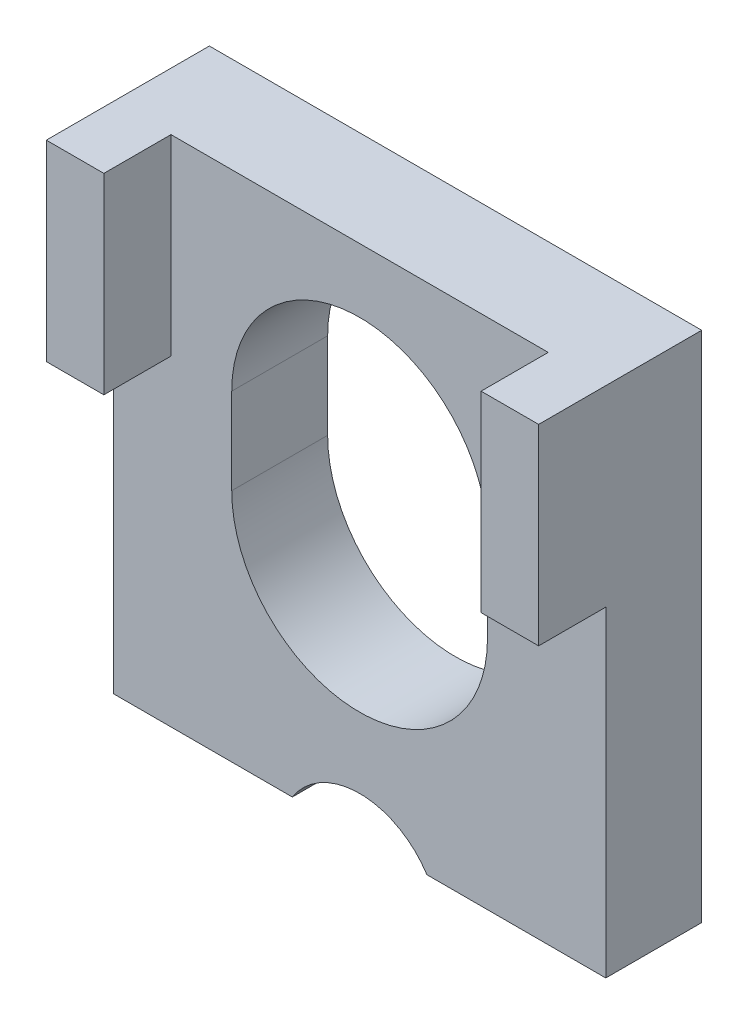
ISO-10303-21;
HEADER;
FILE_DESCRIPTION(('STEP AP214'),'2;1');
FILE_NAME('part.step','',(''),(''),'','','');
FILE_SCHEMA(('AUTOMOTIVE_DESIGN { 1 0 10303 214 1 1 1 1 }'));
ENDSEC;
DATA;
#1=APPLICATION_CONTEXT('core data for automotive mechanical design processes');
#2=APPLICATION_PROTOCOL_DEFINITION('international standard','automotive_design',2000,#1);
#3=PRODUCT_CONTEXT('',#1,'mechanical');
#4=PRODUCT('Part','Part','',(#3));
#5=PRODUCT_RELATED_PRODUCT_CATEGORY('part','',(#4));
#6=PRODUCT_DEFINITION_FORMATION('','',#4);
#7=PRODUCT_DEFINITION_CONTEXT('part definition',#1,'design');
#8=PRODUCT_DEFINITION('design','',#6,#7);
#9=PRODUCT_DEFINITION_SHAPE('','',#8);
#10=(LENGTH_UNIT() NAMED_UNIT(*) SI_UNIT(.MILLI.,.METRE.));
#11=(NAMED_UNIT(*) PLANE_ANGLE_UNIT() SI_UNIT($,.RADIAN.));
#12=(NAMED_UNIT(*) SI_UNIT($,.STERADIAN.) SOLID_ANGLE_UNIT());
#13=UNCERTAINTY_MEASURE_WITH_UNIT(LENGTH_MEASURE(1.E-05),#10,'distance_accuracy_value','');
#14=(GEOMETRIC_REPRESENTATION_CONTEXT(3) GLOBAL_UNCERTAINTY_ASSIGNED_CONTEXT((#13)) GLOBAL_UNIT_ASSIGNED_CONTEXT((#10,
#11,#12)) REPRESENTATION_CONTEXT('',''));
#15=CARTESIAN_POINT('',(0.,0.,0.));
#16=DIRECTION('',(0.,0.,1.));
#17=DIRECTION('',(1.,0.,0.));
#18=AXIS2_PLACEMENT_3D('',#15,#16,#17);
#19=CARTESIAN_POINT('',(0.,-3.65897627091936,3.));
#20=DIRECTION('',(0.,0.,-1.));
#21=DIRECTION('',(-1.,0.,0.));
#22=AXIS2_PLACEMENT_3D('',#19,#20,#21);
#23=PLANE('',#22);
#24=CARTESIAN_POINT('',(0.,7.73749960693732,3.));
#25=DIRECTION('',(0.,0.,1.));
#26=DIRECTION('',(1.,0.,0.));
#27=AXIS2_PLACEMENT_3D('',#24,#25,#26);
#28=CIRCLE('',#27,4.);
#29=CARTESIAN_POINT('',(4.,7.73749960693732,3.));
#30=VERTEX_POINT('',#29);
#31=CARTESIAN_POINT('',(-4.,7.73749960693732,3.));
#32=VERTEX_POINT('',#31);
#33=EDGE_CURVE('E211',#30,#32,#28,.T.);
#34=ORIENTED_EDGE('',*,*,#33,.F.);
#35=DIRECTION('',(0.,1.,0.));
#36=VECTOR('',#35,1.);
#37=CARTESIAN_POINT('',(4.,7.73749960693732,3.));
#38=LINE('',#37,#36);
#39=CARTESIAN_POINT('',(4.,5.04102372908064,3.));
#40=VERTEX_POINT('',#39);
#41=EDGE_CURVE('E219',#40,#30,#38,.T.);
#42=ORIENTED_EDGE('',*,*,#41,.F.);
#43=CARTESIAN_POINT('',(0.,5.04102372908064,3.));
#44=DIRECTION('',(0.,0.,1.));
#45=DIRECTION('',(1.,0.,0.));
#46=AXIS2_PLACEMENT_3D('',#43,#44,#45);
#47=CIRCLE('',#46,4.);
#48=CARTESIAN_POINT('',(-4.,5.04102372908064,3.));
#49=VERTEX_POINT('',#48);
#50=EDGE_CURVE('E216',#49,#40,#47,.T.);
#51=ORIENTED_EDGE('',*,*,#50,.F.);
#52=DIRECTION('',(0.,-1.,0.));
#53=VECTOR('',#52,1.);
#54=CARTESIAN_POINT('',(-4.,7.73749960693732,3.));
#55=LINE('',#54,#53);
#56=EDGE_CURVE('E213',#32,#49,#55,.T.);
#57=ORIENTED_EDGE('',*,*,#56,.F.);
#58=EDGE_LOOP('',(#34,#42,#51,#57));
#59=FACE_BOUND('',#58,.T.);
#60=DIRECTION('',(0.,-1.,0.));
#61=VECTOR('',#60,1.);
#62=CARTESIAN_POINT('',(5.9,13.7374996069373,3.));
#63=LINE('',#62,#61);
#64=CARTESIAN_POINT('',(5.9,13.7374996069373,3.));
#65=VERTEX_POINT('',#64);
#66=CARTESIAN_POINT('',(5.9,7.73749960693732,3.));
#67=VERTEX_POINT('',#66);
#68=EDGE_CURVE('E173',#65,#67,#63,.T.);
#69=ORIENTED_EDGE('',*,*,#68,.F.);
#70=DIRECTION('',(-1.,0.,0.));
#71=VECTOR('',#70,1.);
#72=CARTESIAN_POINT('',(-7.7,13.7374996069373,3.));
#73=LINE('',#72,#71);
#74=CARTESIAN_POINT('',(-5.9,13.7374996069373,3.));
#75=VERTEX_POINT('',#74);
#76=EDGE_CURVE('E252',#65,#75,#73,.T.);
#77=ORIENTED_EDGE('',*,*,#76,.T.);
#78=DIRECTION('',(0.,1.,0.));
#79=VECTOR('',#78,1.);
#80=CARTESIAN_POINT('',(-5.9,13.7374996069373,3.));
#81=LINE('',#80,#79);
#82=CARTESIAN_POINT('',(-5.9,7.73749960693732,3.));
#83=VERTEX_POINT('',#82);
#84=EDGE_CURVE('E190',#83,#75,#81,.T.);
#85=ORIENTED_EDGE('',*,*,#84,.F.);
#86=DIRECTION('',(1.,0.,0.));
#87=VECTOR('',#86,1.);
#88=CARTESIAN_POINT('',(-7.7,7.73749960693732,3.));
#89=LINE('',#88,#87);
#90=CARTESIAN_POINT('',(-7.7,7.73749960693732,3.));
#91=VERTEX_POINT('',#90);
#92=EDGE_CURVE('E185',#91,#83,#89,.T.);
#93=ORIENTED_EDGE('',*,*,#92,.F.);
#94=DIRECTION('',(0.,-1.,0.));
#95=VECTOR('',#94,1.);
#96=CARTESIAN_POINT('',(-7.7,13.7374996069373,3.));
#97=LINE('',#96,#95);
#98=CARTESIAN_POINT('',(-7.7,-2.3093981141027,3.));
#99=VERTEX_POINT('',#98);
#100=EDGE_CURVE('E242',#91,#99,#97,.T.);
#101=ORIENTED_EDGE('',*,*,#100,.T.);
#102=DIRECTION('',(1.,0.,0.));
#103=VECTOR('',#102,1.);
#104=CARTESIAN_POINT('',(-7.7,-2.3093981141027,3.));
#105=LINE('',#104,#103);
#106=CARTESIAN_POINT('',(-2.10443313000041,-2.3093981141027,3.));
#107=VERTEX_POINT('',#106);
#108=EDGE_CURVE('E244',#99,#107,#105,.T.);
#109=ORIENTED_EDGE('',*,*,#108,.T.);
#110=CARTESIAN_POINT('',(0.,-3.65897627091936,3.));
#111=DIRECTION('',(0.,0.,-1.));
#112=DIRECTION('',(-1.,0.,0.));
#113=AXIS2_PLACEMENT_3D('',#110,#111,#112);
#114=CIRCLE('',#113,2.5);
#115=CARTESIAN_POINT('',(2.10443313000041,-2.3093981141027,3.));
#116=VERTEX_POINT('',#115);
#117=EDGE_CURVE('E247',#107,#116,#114,.T.);
#118=ORIENTED_EDGE('',*,*,#117,.T.);
#119=DIRECTION('',(1.,0.,0.));
#120=VECTOR('',#119,1.);
#121=CARTESIAN_POINT('',(7.7,-2.3093981141027,3.));
#122=LINE('',#121,#120);
#123=CARTESIAN_POINT('',(7.7,-2.3093981141027,3.));
#124=VERTEX_POINT('',#123);
#125=EDGE_CURVE('E249',#116,#124,#122,.T.);
#126=ORIENTED_EDGE('',*,*,#125,.T.);
#127=DIRECTION('',(0.,1.,0.));
#128=VECTOR('',#127,1.);
#129=CARTESIAN_POINT('',(7.7,-0.0396047922675049,3.));
#130=LINE('',#129,#128);
#131=CARTESIAN_POINT('',(7.7,7.73749960693732,3.));
#132=VERTEX_POINT('',#131);
#133=EDGE_CURVE('E53',#124,#132,#130,.T.);
#134=ORIENTED_EDGE('',*,*,#133,.T.);
#135=DIRECTION('',(1.,0.,0.));
#136=VECTOR('',#135,1.);
#137=CARTESIAN_POINT('',(7.7,7.73749960693732,3.));
#138=LINE('',#137,#136);
#139=EDGE_CURVE('E48',#67,#132,#138,.T.);
#140=ORIENTED_EDGE('',*,*,#139,.F.);
#141=EDGE_LOOP('',(#69,#77,#85,#93,#101,#109,#118,#126,#134,#140));
#142=FACE_BOUND('',#141,.T.);
#143=ADVANCED_FACE('F33',(#59,#142),#23,.F.);
#144=CARTESIAN_POINT('',(0.,-3.65897627091936,0.));
#145=DIRECTION('',(0.,0.,-1.));
#146=DIRECTION('',(-1.,0.,0.));
#147=AXIS2_PLACEMENT_3D('',#144,#145,#146);
#148=PLANE('',#147);
#149=DIRECTION('',(0.,-1.,0.));
#150=VECTOR('',#149,1.);
#151=CARTESIAN_POINT('',(-7.7,-0.0396047922675089,0.));
#152=LINE('',#151,#150);
#153=CARTESIAN_POINT('',(-7.7,13.7374996069373,0.));
#154=VERTEX_POINT('',#153);
#155=CARTESIAN_POINT('',(-7.7,-2.3093981141027,0.));
#156=VERTEX_POINT('',#155);
#157=EDGE_CURVE('E241',#154,#156,#152,.T.);
#158=ORIENTED_EDGE('',*,*,#157,.F.);
#159=DIRECTION('',(-1.,0.,0.));
#160=VECTOR('',#159,1.);
#161=CARTESIAN_POINT('',(-7.7,13.7374996069373,0.));
#162=LINE('',#161,#160);
#163=CARTESIAN_POINT('',(7.7,13.7374996069373,0.));
#164=VERTEX_POINT('',#163);
#165=EDGE_CURVE('E245',#164,#154,#162,.T.);
#166=ORIENTED_EDGE('',*,*,#165,.F.);
#167=DIRECTION('',(0.,1.,0.));
#168=VECTOR('',#167,1.);
#169=CARTESIAN_POINT('',(7.7,13.7374996069373,0.));
#170=LINE('',#169,#168);
#171=CARTESIAN_POINT('',(7.7,-2.3093981141027,0.));
#172=VERTEX_POINT('',#171);
#173=EDGE_CURVE('E152',#172,#164,#170,.T.);
#174=ORIENTED_EDGE('',*,*,#173,.F.);
#175=DIRECTION('',(1.,0.,0.));
#176=VECTOR('',#175,1.);
#177=CARTESIAN_POINT('',(7.7,-2.3093981141027,0.));
#178=LINE('',#177,#176);
#179=CARTESIAN_POINT('',(2.10443313000041,-2.3093981141027,0.));
#180=VERTEX_POINT('',#179);
#181=EDGE_CURVE('E259',#180,#172,#178,.T.);
#182=ORIENTED_EDGE('',*,*,#181,.F.);
#183=CARTESIAN_POINT('',(0.,-3.65897627091936,0.));
#184=DIRECTION('',(0.,0.,-1.));
#185=DIRECTION('',(-1.,0.,0.));
#186=AXIS2_PLACEMENT_3D('',#183,#184,#185);
#187=CIRCLE('',#186,2.5);
#188=CARTESIAN_POINT('',(-2.10443313000041,-2.3093981141027,0.));
#189=VERTEX_POINT('',#188);
#190=EDGE_CURVE('E257',#189,#180,#187,.T.);
#191=ORIENTED_EDGE('',*,*,#190,.F.);
#192=DIRECTION('',(1.,0.,0.));
#193=VECTOR('',#192,1.);
#194=CARTESIAN_POINT('',(-7.7,-2.3093981141027,0.));
#195=LINE('',#194,#193);
#196=EDGE_CURVE('E255',#156,#189,#195,.T.);
#197=ORIENTED_EDGE('',*,*,#196,.F.);
#198=EDGE_LOOP('',(#158,#166,#174,#182,#191,#197));
#199=FACE_BOUND('',#198,.T.);
#200=DIRECTION('',(0.,1.,0.));
#201=VECTOR('',#200,1.);
#202=CARTESIAN_POINT('',(4.,7.73749960693732,0.));
#203=LINE('',#202,#201);
#204=CARTESIAN_POINT('',(4.,5.04102372908064,0.));
#205=VERTEX_POINT('',#204);
#206=CARTESIAN_POINT('',(4.,7.73749960693732,0.));
#207=VERTEX_POINT('',#206);
#208=EDGE_CURVE('E214',#205,#207,#203,.T.);
#209=ORIENTED_EDGE('',*,*,#208,.T.);
#210=CARTESIAN_POINT('',(0.,7.73749960693732,0.));
#211=DIRECTION('',(0.,0.,1.));
#212=DIRECTION('',(1.,0.,0.));
#213=AXIS2_PLACEMENT_3D('',#210,#211,#212);
#214=CIRCLE('',#213,4.);
#215=CARTESIAN_POINT('',(-4.,7.73749960693732,0.));
#216=VERTEX_POINT('',#215);
#217=EDGE_CURVE('E210',#207,#216,#214,.T.);
#218=ORIENTED_EDGE('',*,*,#217,.T.);
#219=DIRECTION('',(0.,-1.,0.));
#220=VECTOR('',#219,1.);
#221=CARTESIAN_POINT('',(-4.,7.73749960693732,0.));
#222=LINE('',#221,#220);
#223=CARTESIAN_POINT('',(-4.,5.04102372908064,0.));
#224=VERTEX_POINT('',#223);
#225=EDGE_CURVE('E224',#216,#224,#222,.T.);
#226=ORIENTED_EDGE('',*,*,#225,.T.);
#227=CARTESIAN_POINT('',(0.,5.04102372908064,0.));
#228=DIRECTION('',(0.,0.,1.));
#229=DIRECTION('',(1.,0.,0.));
#230=AXIS2_PLACEMENT_3D('',#227,#228,#229);
#231=CIRCLE('',#230,4.);
#232=EDGE_CURVE('E227',#224,#205,#231,.T.);
#233=ORIENTED_EDGE('',*,*,#232,.T.);
#234=EDGE_LOOP('',(#209,#218,#226,#233));
#235=FACE_BOUND('',#234,.T.);
#236=ADVANCED_FACE('F281',(#199,#235),#148,.T.);
#237=CARTESIAN_POINT('',(-7.7,-0.0396047922675089,3.));
#238=DIRECTION('',(1.,0.,0.));
#239=DIRECTION('',(0.,0.,-1.));
#240=AXIS2_PLACEMENT_3D('',#237,#238,#239);
#241=PLANE('',#240);
#242=ORIENTED_EDGE('',*,*,#157,.T.);
#243=DIRECTION('',(0.,0.,-1.));
#244=VECTOR('',#243,1.);
#245=CARTESIAN_POINT('',(-7.7,-2.3093981141027,3.));
#246=LINE('',#245,#244);
#247=EDGE_CURVE('E11',#99,#156,#246,.T.);
#248=ORIENTED_EDGE('',*,*,#247,.F.);
#249=ORIENTED_EDGE('',*,*,#100,.F.);
#250=DIRECTION('',(0.,0.,-1.));
#251=VECTOR('',#250,1.);
#252=CARTESIAN_POINT('',(-7.7,7.73749960693732,5.1));
#253=LINE('',#252,#251);
#254=CARTESIAN_POINT('',(-7.7,7.73749960693732,5.1));
#255=VERTEX_POINT('',#254);
#256=EDGE_CURVE('E207',#255,#91,#253,.T.);
#257=ORIENTED_EDGE('',*,*,#256,.F.);
#258=DIRECTION('',(0.,-1.,0.));
#259=VECTOR('',#258,1.);
#260=CARTESIAN_POINT('',(-7.7,13.7374996069373,5.1));
#261=LINE('',#260,#259);
#262=CARTESIAN_POINT('',(-7.7,13.7374996069373,5.1));
#263=VERTEX_POINT('',#262);
#264=EDGE_CURVE('E186',#263,#255,#261,.T.);
#265=ORIENTED_EDGE('',*,*,#264,.F.);
#266=DIRECTION('',(0.,0.,-1.));
#267=VECTOR('',#266,1.);
#268=CARTESIAN_POINT('',(-7.7,13.7374996069373,3.));
#269=LINE('',#268,#267);
#270=EDGE_CURVE('E157',#263,#154,#269,.T.);
#271=ORIENTED_EDGE('',*,*,#270,.T.);
#272=EDGE_LOOP('',(#242,#248,#249,#257,#265,#271));
#273=FACE_BOUND('',#272,.T.);
#274=ADVANCED_FACE('F35',(#273),#241,.F.);
#275=CARTESIAN_POINT('',(-7.7,-2.3093981141027,3.));
#276=DIRECTION('',(0.,1.,0.));
#277=DIRECTION('',(0.,0.,1.));
#278=AXIS2_PLACEMENT_3D('',#275,#276,#277);
#279=PLANE('',#278);
#280=ORIENTED_EDGE('',*,*,#196,.T.);
#281=DIRECTION('',(0.,0.,-1.));
#282=VECTOR('',#281,1.);
#283=CARTESIAN_POINT('',(-2.10443313000041,-2.3093981141027,3.));
#284=LINE('',#283,#282);
#285=EDGE_CURVE('E41',#107,#189,#284,.T.);
#286=ORIENTED_EDGE('',*,*,#285,.F.);
#287=ORIENTED_EDGE('',*,*,#108,.F.);
#288=ORIENTED_EDGE('',*,*,#247,.T.);
#289=EDGE_LOOP('',(#280,#286,#287,#288));
#290=FACE_BOUND('',#289,.T.);
#291=ADVANCED_FACE('F307',(#290),#279,.F.);
#292=CARTESIAN_POINT('',(0.,-3.65897627091936,3.));
#293=DIRECTION('',(0.,0.,-1.));
#294=DIRECTION('',(-1.,0.,0.));
#295=AXIS2_PLACEMENT_3D('',#292,#293,#294);
#296=CYLINDRICAL_SURFACE('',#295,2.5);
#297=ORIENTED_EDGE('',*,*,#190,.T.);
#298=DIRECTION('',(0.,0.,-1.));
#299=VECTOR('',#298,1.);
#300=CARTESIAN_POINT('',(2.10443313000041,-2.3093981141027,3.));
#301=LINE('',#300,#299);
#302=EDGE_CURVE('E267',#116,#180,#301,.T.);
#303=ORIENTED_EDGE('',*,*,#302,.F.);
#304=ORIENTED_EDGE('',*,*,#117,.F.);
#305=ORIENTED_EDGE('',*,*,#285,.T.);
#306=EDGE_LOOP('',(#297,#303,#304,#305));
#307=FACE_BOUND('',#306,.T.);
#308=ADVANCED_FACE('F274',(#307),#296,.F.);
#309=CARTESIAN_POINT('',(7.7,-2.3093981141027,3.));
#310=DIRECTION('',(0.,1.,0.));
#311=DIRECTION('',(-1.,0.,0.));
#312=AXIS2_PLACEMENT_3D('',#309,#310,#311);
#313=PLANE('',#312);
#314=ORIENTED_EDGE('',*,*,#181,.T.);
#315=DIRECTION('',(0.,0.,-1.));
#316=VECTOR('',#315,1.);
#317=CARTESIAN_POINT('',(7.7,-2.3093981141027,3.));
#318=LINE('',#317,#316);
#319=EDGE_CURVE('E156',#124,#172,#318,.T.);
#320=ORIENTED_EDGE('',*,*,#319,.F.);
#321=ORIENTED_EDGE('',*,*,#125,.F.);
#322=ORIENTED_EDGE('',*,*,#302,.T.);
#323=EDGE_LOOP('',(#314,#320,#321,#322));
#324=FACE_BOUND('',#323,.T.);
#325=ADVANCED_FACE('F285',(#324),#313,.F.);
#326=CARTESIAN_POINT('',(7.7,13.7374996069373,3.));
#327=DIRECTION('',(-1.,0.,0.));
#328=DIRECTION('',(0.,-1.,0.));
#329=AXIS2_PLACEMENT_3D('',#326,#327,#328);
#330=PLANE('',#329);
#331=ORIENTED_EDGE('',*,*,#173,.T.);
#332=DIRECTION('',(0.,0.,-1.));
#333=VECTOR('',#332,1.);
#334=CARTESIAN_POINT('',(7.7,13.7374996069373,3.));
#335=LINE('',#334,#333);
#336=CARTESIAN_POINT('',(7.7,13.7374996069373,5.1));
#337=VERTEX_POINT('',#336);
#338=EDGE_CURVE('E145',#337,#164,#335,.T.);
#339=ORIENTED_EDGE('',*,*,#338,.F.);
#340=DIRECTION('',(0.,1.,0.));
#341=VECTOR('',#340,1.);
#342=CARTESIAN_POINT('',(7.7,13.7374996069373,5.1));
#343=LINE('',#342,#341);
#344=CARTESIAN_POINT('',(7.7,7.73749960693732,5.1));
#345=VERTEX_POINT('',#344);
#346=EDGE_CURVE('E150',#345,#337,#343,.T.);
#347=ORIENTED_EDGE('',*,*,#346,.F.);
#348=DIRECTION('',(0.,0.,-1.));
#349=VECTOR('',#348,1.);
#350=CARTESIAN_POINT('',(7.7,7.73749960693732,5.1));
#351=LINE('',#350,#349);
#352=EDGE_CURVE('E178',#345,#132,#351,.T.);
#353=ORIENTED_EDGE('',*,*,#352,.T.);
#354=ORIENTED_EDGE('',*,*,#133,.F.);
#355=ORIENTED_EDGE('',*,*,#319,.T.);
#356=EDGE_LOOP('',(#331,#339,#347,#353,#354,#355));
#357=FACE_BOUND('',#356,.T.);
#358=ADVANCED_FACE('F147',(#357),#330,.F.);
#359=CARTESIAN_POINT('',(-7.7,13.7374996069373,3.));
#360=DIRECTION('',(0.,-1.,0.));
#361=DIRECTION('',(0.,0.,-1.));
#362=AXIS2_PLACEMENT_3D('',#359,#360,#361);
#363=PLANE('',#362);
#364=ORIENTED_EDGE('',*,*,#165,.T.);
#365=ORIENTED_EDGE('',*,*,#270,.F.);
#366=DIRECTION('',(-1.,0.,0.));
#367=VECTOR('',#366,1.);
#368=CARTESIAN_POINT('',(-7.7,13.7374996069373,5.1));
#369=LINE('',#368,#367);
#370=CARTESIAN_POINT('',(-5.9,13.7374996069373,5.1));
#371=VERTEX_POINT('',#370);
#372=EDGE_CURVE('E194',#371,#263,#369,.T.);
#373=ORIENTED_EDGE('',*,*,#372,.F.);
#374=DIRECTION('',(0.,0.,-1.));
#375=VECTOR('',#374,1.);
#376=CARTESIAN_POINT('',(-5.9,13.7374996069373,5.1));
#377=LINE('',#376,#375);
#378=EDGE_CURVE('E197',#371,#75,#377,.T.);
#379=ORIENTED_EDGE('',*,*,#378,.T.);
#380=ORIENTED_EDGE('',*,*,#76,.F.);
#381=DIRECTION('',(0.,0.,-1.));
#382=VECTOR('',#381,1.);
#383=CARTESIAN_POINT('',(5.9,13.7374996069373,5.1));
#384=LINE('',#383,#382);
#385=CARTESIAN_POINT('',(5.9,13.7374996069373,5.1));
#386=VERTEX_POINT('',#385);
#387=EDGE_CURVE('E163',#386,#65,#384,.T.);
#388=ORIENTED_EDGE('',*,*,#387,.F.);
#389=DIRECTION('',(-1.,0.,0.));
#390=VECTOR('',#389,1.);
#391=CARTESIAN_POINT('',(7.7,13.7374996069373,5.1));
#392=LINE('',#391,#390);
#393=EDGE_CURVE('E160',#337,#386,#392,.T.);
#394=ORIENTED_EDGE('',*,*,#393,.F.);
#395=ORIENTED_EDGE('',*,*,#338,.T.);
#396=EDGE_LOOP('',(#364,#365,#373,#379,#380,#388,#394,#395));
#397=FACE_BOUND('',#396,.T.);
#398=ADVANCED_FACE('F161',(#397),#363,.F.);
#399=CARTESIAN_POINT('',(0.,7.73749960693732,3.));
#400=DIRECTION('',(0.,0.,-1.));
#401=DIRECTION('',(-1.,0.,0.));
#402=AXIS2_PLACEMENT_3D('',#399,#400,#401);
#403=CYLINDRICAL_SURFACE('',#402,4.);
#404=ORIENTED_EDGE('',*,*,#217,.F.);
#405=DIRECTION('',(0.,0.,-1.));
#406=VECTOR('',#405,1.);
#407=CARTESIAN_POINT('',(4.,7.73749960693732,3.));
#408=LINE('',#407,#406);
#409=EDGE_CURVE('E221',#30,#207,#408,.T.);
#410=ORIENTED_EDGE('',*,*,#409,.F.);
#411=ORIENTED_EDGE('',*,*,#33,.T.);
#412=DIRECTION('',(0.,0.,-1.));
#413=VECTOR('',#412,1.);
#414=CARTESIAN_POINT('',(-4.,7.73749960693732,3.));
#415=LINE('',#414,#413);
#416=EDGE_CURVE('E238',#32,#216,#415,.T.);
#417=ORIENTED_EDGE('',*,*,#416,.T.);
#418=EDGE_LOOP('',(#404,#410,#411,#417));
#419=FACE_BOUND('',#418,.T.);
#420=ADVANCED_FACE('F323',(#419),#403,.F.);
#421=CARTESIAN_POINT('',(-4.,7.73749960693732,3.));
#422=DIRECTION('',(1.,0.,0.));
#423=DIRECTION('',(0.,1.,0.));
#424=AXIS2_PLACEMENT_3D('',#421,#422,#423);
#425=PLANE('',#424);
#426=ORIENTED_EDGE('',*,*,#225,.F.);
#427=ORIENTED_EDGE('',*,*,#416,.F.);
#428=ORIENTED_EDGE('',*,*,#56,.T.);
#429=DIRECTION('',(0.,0.,-1.));
#430=VECTOR('',#429,1.);
#431=CARTESIAN_POINT('',(-4.,5.04102372908064,3.));
#432=LINE('',#431,#430);
#433=EDGE_CURVE('E236',#49,#224,#432,.T.);
#434=ORIENTED_EDGE('',*,*,#433,.T.);
#435=EDGE_LOOP('',(#426,#427,#428,#434));
#436=FACE_BOUND('',#435,.T.);
#437=ADVANCED_FACE('F351',(#436),#425,.T.);
#438=CARTESIAN_POINT('',(0.,5.04102372908064,3.));
#439=DIRECTION('',(0.,0.,-1.));
#440=DIRECTION('',(-1.,0.,0.));
#441=AXIS2_PLACEMENT_3D('',#438,#439,#440);
#442=CYLINDRICAL_SURFACE('',#441,4.);
#443=ORIENTED_EDGE('',*,*,#232,.F.);
#444=ORIENTED_EDGE('',*,*,#433,.F.);
#445=ORIENTED_EDGE('',*,*,#50,.T.);
#446=DIRECTION('',(0.,0.,-1.));
#447=VECTOR('',#446,1.);
#448=CARTESIAN_POINT('',(4.,5.04102372908064,3.));
#449=LINE('',#448,#447);
#450=EDGE_CURVE('E234',#40,#205,#449,.T.);
#451=ORIENTED_EDGE('',*,*,#450,.T.);
#452=EDGE_LOOP('',(#443,#444,#445,#451));
#453=FACE_BOUND('',#452,.T.);
#454=ADVANCED_FACE('F358',(#453),#442,.F.);
#455=CARTESIAN_POINT('',(4.,7.73749960693732,3.));
#456=DIRECTION('',(-1.,0.,0.));
#457=DIRECTION('',(0.,-1.,0.));
#458=AXIS2_PLACEMENT_3D('',#455,#456,#457);
#459=PLANE('',#458);
#460=ORIENTED_EDGE('',*,*,#208,.F.);
#461=ORIENTED_EDGE('',*,*,#450,.F.);
#462=ORIENTED_EDGE('',*,*,#41,.T.);
#463=ORIENTED_EDGE('',*,*,#409,.T.);
#464=EDGE_LOOP('',(#460,#461,#462,#463));
#465=FACE_BOUND('',#464,.T.);
#466=ADVANCED_FACE('F365',(#465),#459,.T.);
#467=CARTESIAN_POINT('',(-7.7,7.73749960693732,5.1));
#468=DIRECTION('',(0.,1.,0.));
#469=DIRECTION('',(0.,0.,1.));
#470=AXIS2_PLACEMENT_3D('',#467,#468,#469);
#471=PLANE('',#470);
#472=ORIENTED_EDGE('',*,*,#92,.T.);
#473=DIRECTION('',(0.,0.,-1.));
#474=VECTOR('',#473,1.);
#475=CARTESIAN_POINT('',(-5.9,7.73749960693732,5.1));
#476=LINE('',#475,#474);
#477=CARTESIAN_POINT('',(-5.9,7.73749960693732,5.1));
#478=VERTEX_POINT('',#477);
#479=EDGE_CURVE('E204',#478,#83,#476,.T.);
#480=ORIENTED_EDGE('',*,*,#479,.F.);
#481=DIRECTION('',(1.,0.,0.));
#482=VECTOR('',#481,1.);
#483=CARTESIAN_POINT('',(-7.7,7.73749960693732,5.1));
#484=LINE('',#483,#482);
#485=EDGE_CURVE('E189',#255,#478,#484,.T.);
#486=ORIENTED_EDGE('',*,*,#485,.F.);
#487=ORIENTED_EDGE('',*,*,#256,.T.);
#488=EDGE_LOOP('',(#472,#480,#486,#487));
#489=FACE_BOUND('',#488,.T.);
#490=ADVANCED_FACE('F306',(#489),#471,.F.);
#491=CARTESIAN_POINT('',(-5.9,13.7374996069373,5.1));
#492=DIRECTION('',(-1.,0.,0.));
#493=DIRECTION('',(0.,-1.,0.));
#494=AXIS2_PLACEMENT_3D('',#491,#492,#493);
#495=PLANE('',#494);
#496=ORIENTED_EDGE('',*,*,#84,.T.);
#497=ORIENTED_EDGE('',*,*,#378,.F.);
#498=DIRECTION('',(0.,1.,0.));
#499=VECTOR('',#498,1.);
#500=CARTESIAN_POINT('',(-5.9,13.7374996069373,5.1));
#501=LINE('',#500,#499);
#502=EDGE_CURVE('E192',#478,#371,#501,.T.);
#503=ORIENTED_EDGE('',*,*,#502,.F.);
#504=ORIENTED_EDGE('',*,*,#479,.T.);
#505=EDGE_LOOP('',(#496,#497,#503,#504));
#506=FACE_BOUND('',#505,.T.);
#507=ADVANCED_FACE('F294',(#506),#495,.F.);
#508=CARTESIAN_POINT('',(0.,0.,5.1));
#509=DIRECTION('',(0.,0.,1.));
#510=DIRECTION('',(1.,0.,0.));
#511=AXIS2_PLACEMENT_3D('',#508,#509,#510);
#512=PLANE('',#511);
#513=ORIENTED_EDGE('',*,*,#264,.T.);
#514=ORIENTED_EDGE('',*,*,#485,.T.);
#515=ORIENTED_EDGE('',*,*,#502,.T.);
#516=ORIENTED_EDGE('',*,*,#372,.T.);
#517=EDGE_LOOP('',(#513,#514,#515,#516));
#518=FACE_BOUND('',#517,.T.);
#519=ADVANCED_FACE('F300',(#518),#512,.T.);
#520=CARTESIAN_POINT('',(5.9,13.7374996069373,5.1));
#521=DIRECTION('',(1.,0.,0.));
#522=DIRECTION('',(0.,1.,0.));
#523=AXIS2_PLACEMENT_3D('',#520,#521,#522);
#524=PLANE('',#523);
#525=ORIENTED_EDGE('',*,*,#68,.T.);
#526=DIRECTION('',(0.,0.,-1.));
#527=VECTOR('',#526,1.);
#528=CARTESIAN_POINT('',(5.9,7.73749960693732,5.1));
#529=LINE('',#528,#527);
#530=CARTESIAN_POINT('',(5.9,7.73749960693732,5.1));
#531=VERTEX_POINT('',#530);
#532=EDGE_CURVE('E181',#531,#67,#529,.T.);
#533=ORIENTED_EDGE('',*,*,#532,.F.);
#534=DIRECTION('',(0.,-1.,0.));
#535=VECTOR('',#534,1.);
#536=CARTESIAN_POINT('',(5.9,13.7374996069373,5.1));
#537=LINE('',#536,#535);
#538=EDGE_CURVE('E166',#386,#531,#537,.T.);
#539=ORIENTED_EDGE('',*,*,#538,.F.);
#540=ORIENTED_EDGE('',*,*,#387,.T.);
#541=EDGE_LOOP('',(#525,#533,#539,#540));
#542=FACE_BOUND('',#541,.T.);
#543=ADVANCED_FACE('F291',(#542),#524,.F.);
#544=CARTESIAN_POINT('',(7.7,7.73749960693732,5.1));
#545=DIRECTION('',(0.,1.,0.));
#546=DIRECTION('',(0.,0.,1.));
#547=AXIS2_PLACEMENT_3D('',#544,#545,#546);
#548=PLANE('',#547);
#549=ORIENTED_EDGE('',*,*,#139,.T.);
#550=ORIENTED_EDGE('',*,*,#352,.F.);
#551=DIRECTION('',(1.,0.,0.));
#552=VECTOR('',#551,1.);
#553=CARTESIAN_POINT('',(7.7,7.73749960693732,5.1));
#554=LINE('',#553,#552);
#555=EDGE_CURVE('E170',#531,#345,#554,.T.);
#556=ORIENTED_EDGE('',*,*,#555,.F.);
#557=ORIENTED_EDGE('',*,*,#532,.T.);
#558=EDGE_LOOP('',(#549,#550,#556,#557));
#559=FACE_BOUND('',#558,.T.);
#560=ADVANCED_FACE('F288',(#559),#548,.F.);
#561=CARTESIAN_POINT('',(0.,0.,5.1));
#562=DIRECTION('',(0.,0.,-1.));
#563=DIRECTION('',(-1.,0.,0.));
#564=AXIS2_PLACEMENT_3D('',#561,#562,#563);
#565=PLANE('',#564);
#566=ORIENTED_EDGE('',*,*,#346,.T.);
#567=ORIENTED_EDGE('',*,*,#393,.T.);
#568=ORIENTED_EDGE('',*,*,#538,.T.);
#569=ORIENTED_EDGE('',*,*,#555,.T.);
#570=EDGE_LOOP('',(#566,#567,#568,#569));
#571=FACE_BOUND('',#570,.T.);
#572=ADVANCED_FACE('F168',(#571),#565,.F.);
#573=CLOSED_SHELL('',(#143,#236,#274,#291,#308,#325,#358,#398,#420,#437,#454,#466,#490,#507,
#519,#543,#560,#572));
#574=MANIFOLD_SOLID_BREP('B2',#573);
#575=ADVANCED_BREP_SHAPE_REPRESENTATION('',(#18,#574),#14);
#576=SHAPE_DEFINITION_REPRESENTATION(#9,#575);
ENDSEC;
END-ISO-10303-21;
